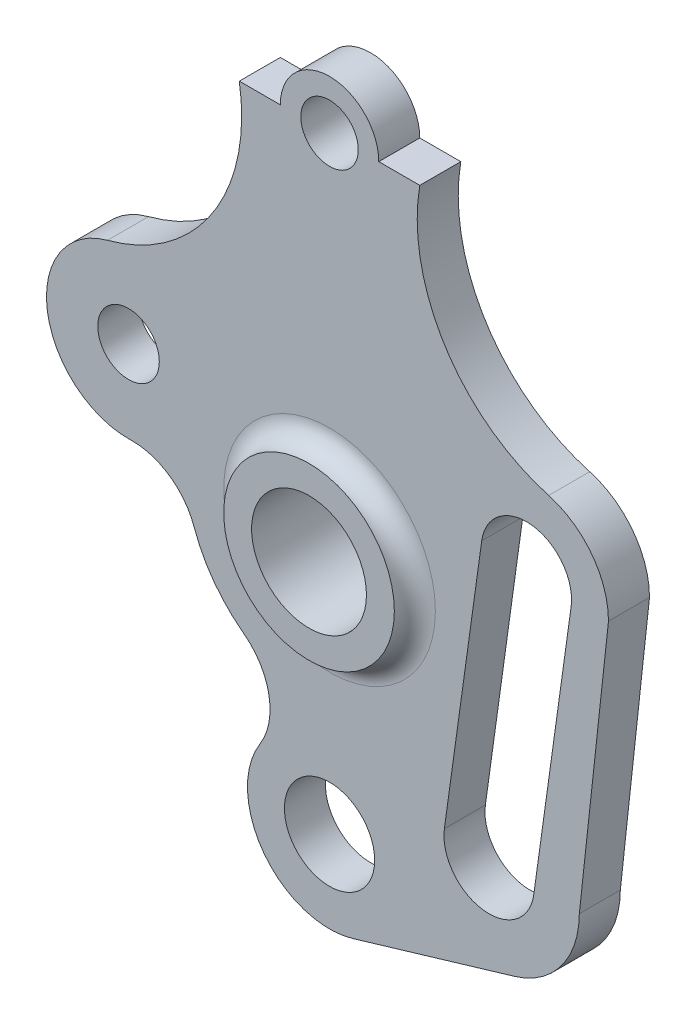
ISO-10303-21;
HEADER;
FILE_DESCRIPTION(('STEP AP214'),'2;1');
FILE_NAME('part.step','',(''),(''),'','','');
FILE_SCHEMA(('AUTOMOTIVE_DESIGN { 1 0 10303 214 1 1 1 1 }'));
ENDSEC;
DATA;
#1=APPLICATION_CONTEXT('core data for automotive mechanical design processes');
#2=APPLICATION_PROTOCOL_DEFINITION('international standard','automotive_design',2000,#1);
#3=PRODUCT_CONTEXT('',#1,'mechanical');
#4=PRODUCT('Part','Part','',(#3));
#5=PRODUCT_RELATED_PRODUCT_CATEGORY('part','',(#4));
#6=PRODUCT_DEFINITION_FORMATION('','',#4);
#7=PRODUCT_DEFINITION_CONTEXT('part definition',#1,'design');
#8=PRODUCT_DEFINITION('design','',#6,#7);
#9=PRODUCT_DEFINITION_SHAPE('','',#8);
#10=(LENGTH_UNIT() NAMED_UNIT(*) SI_UNIT(.MILLI.,.METRE.));
#11=(NAMED_UNIT(*) PLANE_ANGLE_UNIT() SI_UNIT($,.RADIAN.));
#12=(NAMED_UNIT(*) SI_UNIT($,.STERADIAN.) SOLID_ANGLE_UNIT());
#13=UNCERTAINTY_MEASURE_WITH_UNIT(LENGTH_MEASURE(1.E-05),#10,'distance_accuracy_value','');
#14=(GEOMETRIC_REPRESENTATION_CONTEXT(3) GLOBAL_UNCERTAINTY_ASSIGNED_CONTEXT((#13)) GLOBAL_UNIT_ASSIGNED_CONTEXT((#10,
#11,#12)) REPRESENTATION_CONTEXT('',''));
#15=CARTESIAN_POINT('',(0.,0.,0.));
#16=DIRECTION('',(0.,0.,1.));
#17=DIRECTION('',(1.,0.,0.));
#18=AXIS2_PLACEMENT_3D('',#15,#16,#17);
#19=CARTESIAN_POINT('',(0.,0.,10.));
#20=DIRECTION('',(0.,0.,-1.));
#21=DIRECTION('',(-1.,0.,0.));
#22=AXIS2_PLACEMENT_3D('',#19,#20,#21);
#23=CYLINDRICAL_SURFACE('',#22,20.7992005334818);
#24=CARTESIAN_POINT('',(0.,0.,-10.));
#25=DIRECTION('',(0.,0.,1.));
#26=DIRECTION('',(1.,0.,0.));
#27=AXIS2_PLACEMENT_3D('',#24,#25,#26);
#28=CIRCLE('',#27,20.7992005334818);
#29=CARTESIAN_POINT('',(20.7992005334818,0.,-10.));
#30=VERTEX_POINT('',#29);
#31=EDGE_CURVE('E339',#30,#30,#28,.T.);
#32=ORIENTED_EDGE('',*,*,#31,.T.);
#33=EDGE_LOOP('',(#32));
#34=FACE_BOUND('',#33,.T.);
#35=CARTESIAN_POINT('',(0.,0.,-5.));
#36=DIRECTION('',(0.,0.,1.));
#37=DIRECTION('',(1.,0.,0.));
#38=AXIS2_PLACEMENT_3D('',#35,#36,#37);
#39=CIRCLE('',#38,20.7992005334818);
#40=CARTESIAN_POINT('',(20.7992005334818,0.,-5.));
#41=VERTEX_POINT('',#40);
#42=EDGE_CURVE('E53',#41,#41,#39,.T.);
#43=ORIENTED_EDGE('',*,*,#42,.F.);
#44=EDGE_LOOP('',(#43));
#45=FACE_BOUND('',#44,.T.);
#46=ADVANCED_FACE('F43',(#34,#45),#23,.T.);
#47=CARTESIAN_POINT('',(0.,0.,10.));
#48=DIRECTION('',(0.,0.,-1.));
#49=DIRECTION('',(-1.,0.,0.));
#50=AXIS2_PLACEMENT_3D('',#47,#48,#49);
#51=CYLINDRICAL_SURFACE('',#50,14.);
#52=CARTESIAN_POINT('',(0.,0.,10.));
#53=DIRECTION('',(0.,0.,1.));
#54=DIRECTION('',(1.,0.,0.));
#55=AXIS2_PLACEMENT_3D('',#52,#53,#54);
#56=CIRCLE('',#55,14.);
#57=CARTESIAN_POINT('',(14.,0.,10.));
#58=VERTEX_POINT('',#57);
#59=EDGE_CURVE('E334',#58,#58,#56,.T.);
#60=ORIENTED_EDGE('',*,*,#59,.T.);
#61=EDGE_LOOP('',(#60));
#62=FACE_BOUND('',#61,.T.);
#63=CARTESIAN_POINT('',(0.,0.,-10.));
#64=DIRECTION('',(0.,0.,1.));
#65=DIRECTION('',(1.,0.,0.));
#66=AXIS2_PLACEMENT_3D('',#63,#64,#65);
#67=CIRCLE('',#66,14.);
#68=CARTESIAN_POINT('',(14.,0.,-10.));
#69=VERTEX_POINT('',#68);
#70=EDGE_CURVE('E323',#69,#69,#67,.T.);
#71=ORIENTED_EDGE('',*,*,#70,.F.);
#72=EDGE_LOOP('',(#71));
#73=FACE_BOUND('',#72,.T.);
#74=ADVANCED_FACE('F356',(#62,#73),#51,.F.);
#75=CARTESIAN_POINT('',(0.,0.,10.));
#76=DIRECTION('',(0.,0.,1.));
#77=DIRECTION('',(1.,0.,0.));
#78=AXIS2_PLACEMENT_3D('',#75,#76,#77);
#79=PLANE('',#78);
#80=ORIENTED_EDGE('',*,*,#59,.F.);
#81=EDGE_LOOP('',(#80));
#82=FACE_BOUND('',#81,.T.);
#83=CARTESIAN_POINT('',(0.,0.,10.));
#84=DIRECTION('',(0.,0.,1.));
#85=DIRECTION('',(1.,0.,0.));
#86=AXIS2_PLACEMENT_3D('',#83,#84,#85);
#87=CIRCLE('',#86,20.7992005334818);
#88=CARTESIAN_POINT('',(20.7992005334818,0.,10.));
#89=VERTEX_POINT('',#88);
#90=EDGE_CURVE('E338',#89,#89,#87,.T.);
#91=ORIENTED_EDGE('',*,*,#90,.T.);
#92=EDGE_LOOP('',(#91));
#93=FACE_BOUND('',#92,.T.);
#94=ADVANCED_FACE('F362',(#82,#93),#79,.T.);
#95=CARTESIAN_POINT('',(0.,0.,-10.));
#96=DIRECTION('',(0.,0.,1.));
#97=DIRECTION('',(1.,0.,0.));
#98=AXIS2_PLACEMENT_3D('',#95,#96,#97);
#99=PLANE('',#98);
#100=ORIENTED_EDGE('',*,*,#70,.T.);
#101=EDGE_LOOP('',(#100));
#102=FACE_BOUND('',#101,.T.);
#103=ORIENTED_EDGE('',*,*,#31,.F.);
#104=EDGE_LOOP('',(#103));
#105=FACE_BOUND('',#104,.T.);
#106=ADVANCED_FACE('F365',(#102,#105),#99,.F.);
#107=CARTESIAN_POINT('',(22.0988600567901,-74.2925929364105,5.));
#108=DIRECTION('',(-0.285111005991782,0.958494504033463,0.));
#109=DIRECTION('',(-0.958494504033463,-0.285111005991782,0.));
#110=AXIS2_PLACEMENT_3D('',#107,#108,#109);
#111=PLANE('',#110);
#112=DIRECTION('',(0.958494504033463,0.285111005991782,0.));
#113=VECTOR('',#112,1.);
#114=CARTESIAN_POINT('',(22.0988600567901,-74.2925929364105,-5.));
#115=LINE('',#114,#113);
#116=CARTESIAN_POINT('',(5.70222011983564,-79.1698900806693,-5.));
#117=VERTEX_POINT('',#116);
#118=CARTESIAN_POINT('',(45.1610925178546,-67.4325678974345,-5.));
#119=VERTEX_POINT('',#118);
#120=EDGE_CURVE('E235',#117,#119,#115,.T.);
#121=ORIENTED_EDGE('',*,*,#120,.T.);
#122=DIRECTION('',(0.,0.,-1.));
#123=VECTOR('',#122,1.);
#124=CARTESIAN_POINT('',(45.1610925178546,-67.4325678974345,5.));
#125=LINE('',#124,#123);
#126=CARTESIAN_POINT('',(45.1610925178546,-67.4325678974345,5.));
#127=VERTEX_POINT('',#126);
#128=EDGE_CURVE('E319',#127,#119,#125,.T.);
#129=ORIENTED_EDGE('',*,*,#128,.F.);
#130=DIRECTION('',(0.958494504033463,0.285111005991782,0.));
#131=VECTOR('',#130,1.);
#132=CARTESIAN_POINT('',(22.0988600567901,-74.2925929364105,5.));
#133=LINE('',#132,#131);
#134=CARTESIAN_POINT('',(5.70222011983564,-79.1698900806693,5.));
#135=VERTEX_POINT('',#134);
#136=EDGE_CURVE('E473',#135,#127,#133,.T.);
#137=ORIENTED_EDGE('',*,*,#136,.F.);
#138=DIRECTION('',(0.,0.,-1.));
#139=VECTOR('',#138,1.);
#140=CARTESIAN_POINT('',(5.70222011983564,-79.1698900806693,5.));
#141=LINE('',#140,#139);
#142=EDGE_CURVE('E283',#135,#117,#141,.T.);
#143=ORIENTED_EDGE('',*,*,#142,.T.);
#144=EDGE_LOOP('',(#121,#129,#137,#143));
#145=FACE_BOUND('',#144,.T.);
#146=ADVANCED_FACE('F368',(#145),#111,.F.);
#147=CARTESIAN_POINT('',(38.8886503860354,-46.3456888086984,5.));
#148=DIRECTION('',(0.,0.,-1.));
#149=DIRECTION('',(-1.,0.,0.));
#150=AXIS2_PLACEMENT_3D('',#147,#148,#149);
#151=CYLINDRICAL_SURFACE('',#150,22.);
#152=CARTESIAN_POINT('',(38.8886503860354,-46.3456888086984,-5.));
#153=DIRECTION('',(0.,0.,1.));
#154=DIRECTION('',(1.,0.,0.));
#155=AXIS2_PLACEMENT_3D('',#152,#153,#154);
#156=CIRCLE('',#155,22.);
#157=CARTESIAN_POINT('',(60.8886503860354,-46.3456888086984,-5.));
#158=VERTEX_POINT('',#157);
#159=EDGE_CURVE('E239',#119,#158,#156,.T.);
#160=ORIENTED_EDGE('',*,*,#159,.T.);
#161=DIRECTION('',(0.,0.,-1.));
#162=VECTOR('',#161,1.);
#163=CARTESIAN_POINT('',(60.8886503860354,-46.3456888086984,5.));
#164=LINE('',#163,#162);
#165=CARTESIAN_POINT('',(60.8886503860354,-46.3456888086984,5.));
#166=VERTEX_POINT('',#165);
#167=EDGE_CURVE('E316',#166,#158,#164,.T.);
#168=ORIENTED_EDGE('',*,*,#167,.F.);
#169=CARTESIAN_POINT('',(38.8886503860354,-46.3456888086984,5.));
#170=DIRECTION('',(0.,0.,1.));
#171=DIRECTION('',(1.,0.,0.));
#172=AXIS2_PLACEMENT_3D('',#169,#170,#171);
#173=CIRCLE('',#172,22.);
#174=EDGE_CURVE('E477',#127,#166,#173,.T.);
#175=ORIENTED_EDGE('',*,*,#174,.F.);
#176=ORIENTED_EDGE('',*,*,#128,.T.);
#177=EDGE_LOOP('',(#160,#168,#175,#176));
#178=FACE_BOUND('',#177,.T.);
#179=ADVANCED_FACE('F403',(#178),#151,.T.);
#180=CARTESIAN_POINT('',(65.1605826645187,-7.09120514030537,5.));
#181=DIRECTION('',(0.994130469274751,-0.108187846173051,0.));
#182=DIRECTION('',(0.108187846173051,0.994130469274751,0.));
#183=AXIS2_PLACEMENT_3D('',#180,#181,#182);
#184=PLANE('',#183);
#185=DIRECTION('',(-0.108187846173051,-0.994130469274751,0.));
#186=VECTOR('',#185,1.);
#187=CARTESIAN_POINT('',(65.1605826645187,-7.09120514030537,-5.));
#188=LINE('',#187,#186);
#189=CARTESIAN_POINT('',(68.,19.,-5.));
#190=VERTEX_POINT('',#189);
#191=EDGE_CURVE('E243',#190,#158,#188,.T.);
#192=ORIENTED_EDGE('',*,*,#191,.F.);
#193=DIRECTION('',(0.,0.,-1.));
#194=VECTOR('',#193,1.);
#195=CARTESIAN_POINT('',(68.,19.,5.));
#196=LINE('',#195,#194);
#197=CARTESIAN_POINT('',(68.,19.,5.));
#198=VERTEX_POINT('',#197);
#199=EDGE_CURVE('E313',#198,#190,#196,.T.);
#200=ORIENTED_EDGE('',*,*,#199,.F.);
#201=DIRECTION('',(-0.108187846173051,-0.994130469274751,0.));
#202=VECTOR('',#201,1.);
#203=CARTESIAN_POINT('',(65.1605826645187,-7.09120514030537,5.));
#204=LINE('',#203,#202);
#205=EDGE_CURVE('E484',#198,#166,#204,.T.);
#206=ORIENTED_EDGE('',*,*,#205,.T.);
#207=ORIENTED_EDGE('',*,*,#167,.T.);
#208=EDGE_LOOP('',(#192,#200,#206,#207));
#209=FACE_BOUND('',#208,.T.);
#210=ADVANCED_FACE('F407',(#209),#184,.T.);
#211=CARTESIAN_POINT('',(48.,19.,5.));
#212=DIRECTION('',(0.,0.,-1.));
#213=DIRECTION('',(-1.,0.,0.));
#214=AXIS2_PLACEMENT_3D('',#211,#212,#213);
#215=CYLINDRICAL_SURFACE('',#214,20.);
#216=CARTESIAN_POINT('',(48.,19.,-5.));
#217=DIRECTION('',(0.,0.,1.));
#218=DIRECTION('',(1.,0.,0.));
#219=AXIS2_PLACEMENT_3D('',#216,#217,#218);
#220=CIRCLE('',#219,20.);
#221=CARTESIAN_POINT('',(53.4289837072648,38.2490554549114,-5.));
#222=VERTEX_POINT('',#221);
#223=EDGE_CURVE('E247',#190,#222,#220,.T.);
#224=ORIENTED_EDGE('',*,*,#223,.T.);
#225=DIRECTION('',(0.,0.,-1.));
#226=VECTOR('',#225,1.);
#227=CARTESIAN_POINT('',(53.4289837072648,38.2490554549114,5.));
#228=LINE('',#227,#226);
#229=CARTESIAN_POINT('',(53.4289837072648,38.2490554549114,5.));
#230=VERTEX_POINT('',#229);
#231=EDGE_CURVE('E310',#230,#222,#228,.T.);
#232=ORIENTED_EDGE('',*,*,#231,.F.);
#233=CARTESIAN_POINT('',(48.,19.,5.));
#234=DIRECTION('',(0.,0.,1.));
#235=DIRECTION('',(1.,0.,0.));
#236=AXIS2_PLACEMENT_3D('',#233,#234,#235);
#237=CIRCLE('',#236,20.);
#238=EDGE_CURVE('E488',#198,#230,#237,.T.);
#239=ORIENTED_EDGE('',*,*,#238,.F.);
#240=ORIENTED_EDGE('',*,*,#199,.T.);
#241=EDGE_LOOP('',(#224,#232,#239,#240));
#242=FACE_BOUND('',#241,.T.);
#243=ADVANCED_FACE('F411',(#242),#215,.T.);
#244=CARTESIAN_POINT('',(65.3727478632474,80.5969774557164,5.));
#245=DIRECTION('',(0.,0.,-1.));
#246=DIRECTION('',(-1.,0.,0.));
#247=AXIS2_PLACEMENT_3D('',#244,#245,#246);
#248=CYLINDRICAL_SURFACE('',#247,44.);
#249=CARTESIAN_POINT('',(65.3727478632474,80.5969774557164,-5.));
#250=DIRECTION('',(0.,0.,1.));
#251=DIRECTION('',(1.,0.,0.));
#252=AXIS2_PLACEMENT_3D('',#249,#250,#251);
#253=CIRCLE('',#252,44.);
#254=CARTESIAN_POINT('',(22.,88.,-5.));
#255=VERTEX_POINT('',#254);
#256=EDGE_CURVE('E251',#255,#222,#253,.T.);
#257=ORIENTED_EDGE('',*,*,#256,.F.);
#258=DIRECTION('',(0.,0.,-1.));
#259=VECTOR('',#258,1.);
#260=CARTESIAN_POINT('',(22.,88.,5.));
#261=LINE('',#260,#259);
#262=CARTESIAN_POINT('',(22.,88.,5.));
#263=VERTEX_POINT('',#262);
#264=EDGE_CURVE('E307',#263,#255,#261,.T.);
#265=ORIENTED_EDGE('',*,*,#264,.F.);
#266=CARTESIAN_POINT('',(65.3727478632474,80.5969774557164,5.));
#267=DIRECTION('',(0.,0.,1.));
#268=DIRECTION('',(1.,0.,0.));
#269=AXIS2_PLACEMENT_3D('',#266,#267,#268);
#270=CIRCLE('',#269,44.);
#271=EDGE_CURVE('E491',#263,#230,#270,.T.);
#272=ORIENTED_EDGE('',*,*,#271,.T.);
#273=ORIENTED_EDGE('',*,*,#231,.T.);
#274=EDGE_LOOP('',(#257,#265,#272,#273));
#275=FACE_BOUND('',#274,.T.);
#276=ADVANCED_FACE('F415',(#275),#248,.F.);
#277=CARTESIAN_POINT('',(0.,88.,5.));
#278=DIRECTION('',(0.,1.,0.));
#279=DIRECTION('',(0.,0.,1.));
#280=AXIS2_PLACEMENT_3D('',#277,#278,#279);
#281=PLANE('',#280);
#282=DIRECTION('',(1.,0.,0.));
#283=VECTOR('',#282,1.);
#284=CARTESIAN_POINT('',(0.,88.,-5.));
#285=LINE('',#284,#283);
#286=CARTESIAN_POINT('',(12.,88.,-5.));
#287=VERTEX_POINT('',#286);
#288=EDGE_CURVE('E255',#287,#255,#285,.T.);
#289=ORIENTED_EDGE('',*,*,#288,.F.);
#290=DIRECTION('',(0.,0.,-1.));
#291=VECTOR('',#290,1.);
#292=CARTESIAN_POINT('',(12.,88.,5.));
#293=LINE('',#292,#291);
#294=CARTESIAN_POINT('',(12.,88.,5.));
#295=VERTEX_POINT('',#294);
#296=EDGE_CURVE('E304',#295,#287,#293,.T.);
#297=ORIENTED_EDGE('',*,*,#296,.F.);
#298=DIRECTION('',(1.,0.,0.));
#299=VECTOR('',#298,1.);
#300=CARTESIAN_POINT('',(0.,88.,5.));
#301=LINE('',#300,#299);
#302=EDGE_CURVE('E495',#295,#263,#301,.T.);
#303=ORIENTED_EDGE('',*,*,#302,.T.);
#304=ORIENTED_EDGE('',*,*,#264,.T.);
#305=EDGE_LOOP('',(#289,#297,#303,#304));
#306=FACE_BOUND('',#305,.T.);
#307=ADVANCED_FACE('F419',(#306),#281,.T.);
#308=CARTESIAN_POINT('',(0.,88.,5.));
#309=DIRECTION('',(0.,0.,-1.));
#310=DIRECTION('',(-1.,0.,0.));
#311=AXIS2_PLACEMENT_3D('',#308,#309,#310);
#312=CYLINDRICAL_SURFACE('',#311,12.);
#313=CARTESIAN_POINT('',(0.,88.,-5.));
#314=DIRECTION('',(0.,0.,1.));
#315=DIRECTION('',(1.,0.,0.));
#316=AXIS2_PLACEMENT_3D('',#313,#314,#315);
#317=CIRCLE('',#316,12.);
#318=CARTESIAN_POINT('',(-12.,88.,-5.));
#319=VERTEX_POINT('',#318);
#320=EDGE_CURVE('E259',#287,#319,#317,.T.);
#321=ORIENTED_EDGE('',*,*,#320,.T.);
#322=DIRECTION('',(0.,0.,-1.));
#323=VECTOR('',#322,1.);
#324=CARTESIAN_POINT('',(-12.,88.,5.));
#325=LINE('',#324,#323);
#326=CARTESIAN_POINT('',(-12.,88.,5.));
#327=VERTEX_POINT('',#326);
#328=EDGE_CURVE('E301',#327,#319,#325,.T.);
#329=ORIENTED_EDGE('',*,*,#328,.F.);
#330=CARTESIAN_POINT('',(0.,88.,5.));
#331=DIRECTION('',(0.,0.,1.));
#332=DIRECTION('',(1.,0.,0.));
#333=AXIS2_PLACEMENT_3D('',#330,#331,#332);
#334=CIRCLE('',#333,12.);
#335=EDGE_CURVE('E499',#295,#327,#334,.T.);
#336=ORIENTED_EDGE('',*,*,#335,.F.);
#337=ORIENTED_EDGE('',*,*,#296,.T.);
#338=EDGE_LOOP('',(#321,#329,#336,#337));
#339=FACE_BOUND('',#338,.T.);
#340=ADVANCED_FACE('F423',(#339),#312,.T.);
#341=CARTESIAN_POINT('',(0.,88.,5.));
#342=DIRECTION('',(0.,1.,0.));
#343=DIRECTION('',(0.,0.,1.));
#344=AXIS2_PLACEMENT_3D('',#341,#342,#343);
#345=PLANE('',#344);
#346=DIRECTION('',(1.,0.,0.));
#347=VECTOR('',#346,1.);
#348=CARTESIAN_POINT('',(0.,88.,-5.));
#349=LINE('',#348,#347);
#350=CARTESIAN_POINT('',(-22.,88.,-5.));
#351=VERTEX_POINT('',#350);
#352=EDGE_CURVE('E263',#351,#319,#349,.T.);
#353=ORIENTED_EDGE('',*,*,#352,.F.);
#354=DIRECTION('',(0.,0.,-1.));
#355=VECTOR('',#354,1.);
#356=CARTESIAN_POINT('',(-22.,88.,5.));
#357=LINE('',#356,#355);
#358=CARTESIAN_POINT('',(-22.,88.,5.));
#359=VERTEX_POINT('',#358);
#360=EDGE_CURVE('E298',#359,#351,#357,.T.);
#361=ORIENTED_EDGE('',*,*,#360,.F.);
#362=DIRECTION('',(1.,0.,0.));
#363=VECTOR('',#362,1.);
#364=CARTESIAN_POINT('',(0.,88.,5.));
#365=LINE('',#364,#363);
#366=EDGE_CURVE('E502',#359,#327,#365,.T.);
#367=ORIENTED_EDGE('',*,*,#366,.T.);
#368=ORIENTED_EDGE('',*,*,#328,.T.);
#369=EDGE_LOOP('',(#353,#361,#367,#368));
#370=FACE_BOUND('',#369,.T.);
#371=ADVANCED_FACE('F427',(#370),#345,.T.);
#372=CARTESIAN_POINT('',(-65.4166030040401,80.8586707407114,5.));
#373=DIRECTION('',(0.,0.,-1.));
#374=DIRECTION('',(-1.,0.,0.));
#375=AXIS2_PLACEMENT_3D('',#372,#373,#374);
#376=CYLINDRICAL_SURFACE('',#375,44.);
#377=CARTESIAN_POINT('',(-65.4166030040401,80.8586707407114,-5.));
#378=DIRECTION('',(0.,0.,1.));
#379=DIRECTION('',(1.,0.,0.));
#380=AXIS2_PLACEMENT_3D('',#377,#378,#379);
#381=CIRCLE('',#380,44.);
#382=CARTESIAN_POINT('',(-54.1301884387625,38.3308346064723,-5.));
#383=VERTEX_POINT('',#382);
#384=EDGE_CURVE('E267',#351,#383,#381,.F.);
#385=ORIENTED_EDGE('',*,*,#384,.T.);
#386=DIRECTION('',(0.,0.,-1.));
#387=VECTOR('',#386,1.);
#388=CARTESIAN_POINT('',(-54.1301884387625,38.3308346064723,5.));
#389=LINE('',#388,#387);
#390=CARTESIAN_POINT('',(-54.1301884387625,38.3308346064723,5.));
#391=VERTEX_POINT('',#390);
#392=EDGE_CURVE('E294',#391,#383,#389,.T.);
#393=ORIENTED_EDGE('',*,*,#392,.F.);
#394=CARTESIAN_POINT('',(-65.4166030040401,80.8586707407114,5.));
#395=DIRECTION('',(0.,0.,1.));
#396=DIRECTION('',(1.,0.,0.));
#397=AXIS2_PLACEMENT_3D('',#394,#395,#396);
#398=CIRCLE('',#397,44.);
#399=EDGE_CURVE('E506',#359,#391,#398,.F.);
#400=ORIENTED_EDGE('',*,*,#399,.F.);
#401=ORIENTED_EDGE('',*,*,#360,.T.);
#402=EDGE_LOOP('',(#385,#393,#400,#401));
#403=FACE_BOUND('',#402,.T.);
#404=ADVANCED_FACE('F431',(#403),#376,.F.);
#405=CARTESIAN_POINT('',(-49.,19.,5.));
#406=DIRECTION('',(0.,0.,-1.));
#407=DIRECTION('',(-1.,0.,0.));
#408=AXIS2_PLACEMENT_3D('',#405,#406,#407);
#409=CYLINDRICAL_SURFACE('',#408,20.);
#410=CARTESIAN_POINT('',(-49.,19.,-5.));
#411=DIRECTION('',(0.,0.,1.));
#412=DIRECTION('',(1.,0.,0.));
#413=AXIS2_PLACEMENT_3D('',#410,#411,#412);
#414=CIRCLE('',#413,20.);
#415=CARTESIAN_POINT('',(-48.4929723790289,-0.993572041823168,-5.));
#416=VERTEX_POINT('',#415);
#417=EDGE_CURVE('E270',#383,#416,#414,.T.);
#418=ORIENTED_EDGE('',*,*,#417,.T.);
#419=DIRECTION('',(0.,0.,-1.));
#420=VECTOR('',#419,1.);
#421=CARTESIAN_POINT('',(-48.4929723790289,-0.993572041823168,5.));
#422=LINE('',#421,#420);
#423=CARTESIAN_POINT('',(-48.4929723790289,-0.993572041823168,5.));
#424=VERTEX_POINT('',#423);
#425=EDGE_CURVE('E290',#424,#416,#422,.T.);
#426=ORIENTED_EDGE('',*,*,#425,.F.);
#427=CARTESIAN_POINT('',(-49.,19.,5.));
#428=DIRECTION('',(0.,0.,1.));
#429=DIRECTION('',(1.,0.,0.));
#430=AXIS2_PLACEMENT_3D('',#427,#428,#429);
#431=CIRCLE('',#430,20.);
#432=EDGE_CURVE('E509',#391,#424,#431,.T.);
#433=ORIENTED_EDGE('',*,*,#432,.F.);
#434=ORIENTED_EDGE('',*,*,#392,.T.);
#435=EDGE_LOOP('',(#418,#426,#433,#434));
#436=FACE_BOUND('',#435,.T.);
#437=ADVANCED_FACE('F435',(#436),#409,.T.);
#438=CARTESIAN_POINT('',(-48.0873502822521,-16.9884296752817,5.));
#439=DIRECTION('',(0.,0.,-1.));
#440=DIRECTION('',(-1.,0.,0.));
#441=AXIS2_PLACEMENT_3D('',#438,#439,#440);
#442=CYLINDRICAL_SURFACE('',#441,16.);
#443=CARTESIAN_POINT('',(-48.0873502822521,-16.9884296752817,-5.));
#444=DIRECTION('',(0.,0.,1.));
#445=DIRECTION('',(1.,0.,0.));
#446=AXIS2_PLACEMENT_3D('',#443,#444,#445);
#447=CIRCLE('',#446,16.);
#448=CARTESIAN_POINT('',(-33.001122742722,-11.6587262477423,-5.));
#449=VERTEX_POINT('',#448);
#450=EDGE_CURVE('E273',#416,#449,#447,.F.);
#451=ORIENTED_EDGE('',*,*,#450,.T.);
#452=DIRECTION('',(0.,0.,-1.));
#453=VECTOR('',#452,1.);
#454=CARTESIAN_POINT('',(-33.001122742722,-11.6587262477423,5.));
#455=LINE('',#454,#453);
#456=CARTESIAN_POINT('',(-33.001122742722,-11.6587262477423,5.));
#457=VERTEX_POINT('',#456);
#458=EDGE_CURVE('E196',#457,#449,#455,.T.);
#459=ORIENTED_EDGE('',*,*,#458,.F.);
#460=CARTESIAN_POINT('',(-48.0873502822521,-16.9884296752817,5.));
#461=DIRECTION('',(0.,0.,1.));
#462=DIRECTION('',(1.,0.,0.));
#463=AXIS2_PLACEMENT_3D('',#460,#461,#462);
#464=CIRCLE('',#463,16.);
#465=EDGE_CURVE('E185',#424,#457,#464,.F.);
#466=ORIENTED_EDGE('',*,*,#465,.F.);
#467=ORIENTED_EDGE('',*,*,#425,.T.);
#468=EDGE_LOOP('',(#451,#459,#466,#467));
#469=FACE_BOUND('',#468,.T.);
#470=ADVANCED_FACE('F439',(#469),#442,.F.);
#471=CARTESIAN_POINT('',(0.,0.,5.));
#472=DIRECTION('',(0.,0.,-1.));
#473=DIRECTION('',(-1.,0.,0.));
#474=AXIS2_PLACEMENT_3D('',#471,#472,#473);
#475=CYLINDRICAL_SURFACE('',#474,35.);
#476=CARTESIAN_POINT('',(0.,0.,-5.));
#477=DIRECTION('',(0.,0.,1.));
#478=DIRECTION('',(1.,0.,0.));
#479=AXIS2_PLACEMENT_3D('',#476,#477,#478);
#480=CIRCLE('',#479,35.);
#481=CARTESIAN_POINT('',(-20.9311967607533,-28.0514705882353,-5.));
#482=VERTEX_POINT('',#481);
#483=EDGE_CURVE('E194',#449,#482,#480,.T.);
#484=ORIENTED_EDGE('',*,*,#483,.T.);
#485=DIRECTION('',(0.,0.,-1.));
#486=VECTOR('',#485,1.);
#487=CARTESIAN_POINT('',(-20.9311967607533,-28.0514705882353,5.));
#488=LINE('',#487,#486);
#489=CARTESIAN_POINT('',(-20.9311967607533,-28.0514705882353,5.));
#490=VERTEX_POINT('',#489);
#491=EDGE_CURVE('E191',#490,#482,#488,.T.);
#492=ORIENTED_EDGE('',*,*,#491,.F.);
#493=CARTESIAN_POINT('',(0.,0.,5.));
#494=DIRECTION('',(0.,0.,1.));
#495=DIRECTION('',(1.,0.,0.));
#496=AXIS2_PLACEMENT_3D('',#493,#494,#495);
#497=CIRCLE('',#496,35.);
#498=EDGE_CURVE('E179',#457,#490,#497,.T.);
#499=ORIENTED_EDGE('',*,*,#498,.F.);
#500=ORIENTED_EDGE('',*,*,#458,.T.);
#501=EDGE_LOOP('',(#484,#492,#499,#500));
#502=FACE_BOUND('',#501,.T.);
#503=ADVANCED_FACE('F192',(#502),#475,.T.);
#504=CARTESIAN_POINT('',(-30.4997438513834,-40.875,5.));
#505=DIRECTION('',(0.,0.,-1.));
#506=DIRECTION('',(-1.,0.,0.));
#507=AXIS2_PLACEMENT_3D('',#504,#505,#506);
#508=CYLINDRICAL_SURFACE('',#507,16.);
#509=CARTESIAN_POINT('',(-30.4997438513834,-40.875,-5.));
#510=DIRECTION('',(0.,0.,1.));
#511=DIRECTION('',(1.,0.,0.));
#512=AXIS2_PLACEMENT_3D('',#509,#510,#511);
#513=CIRCLE('',#512,16.);
#514=CARTESIAN_POINT('',(-16.9443021396575,-49.375,-5.));
#515=VERTEX_POINT('',#514);
#516=EDGE_CURVE('E120',#482,#515,#513,.F.);
#517=ORIENTED_EDGE('',*,*,#516,.T.);
#518=DIRECTION('',(0.,0.,-1.));
#519=VECTOR('',#518,1.);
#520=CARTESIAN_POINT('',(-16.9443021396575,-49.375,5.));
#521=LINE('',#520,#519);
#522=CARTESIAN_POINT('',(-16.9443021396575,-49.375,5.));
#523=VERTEX_POINT('',#522);
#524=EDGE_CURVE('E197',#523,#515,#521,.T.);
#525=ORIENTED_EDGE('',*,*,#524,.F.);
#526=CARTESIAN_POINT('',(-30.4997438513834,-40.875,5.));
#527=DIRECTION('',(0.,0.,1.));
#528=DIRECTION('',(1.,0.,0.));
#529=AXIS2_PLACEMENT_3D('',#526,#527,#528);
#530=CIRCLE('',#529,16.);
#531=EDGE_CURVE('E183',#490,#523,#530,.F.);
#532=ORIENTED_EDGE('',*,*,#531,.F.);
#533=ORIENTED_EDGE('',*,*,#491,.T.);
#534=EDGE_LOOP('',(#517,#525,#532,#533));
#535=FACE_BOUND('',#534,.T.);
#536=ADVANCED_FACE('F199',(#535),#508,.F.);
#537=CARTESIAN_POINT('',(38.8886503860354,-46.3456888086984,5.));
#538=DIRECTION('',(0.,0.,-1.));
#539=DIRECTION('',(-1.,0.,0.));
#540=AXIS2_PLACEMENT_3D('',#537,#538,#539);
#541=CYLINDRICAL_SURFACE('',#540,11.);
#542=CARTESIAN_POINT('',(38.8886503860354,-46.3456888086984,-5.));
#543=DIRECTION('',(0.,0.,1.));
#544=DIRECTION('',(1.,0.,0.));
#545=AXIS2_PLACEMENT_3D('',#542,#543,#544);
#546=CIRCLE('',#545,11.);
#547=CARTESIAN_POINT('',(27.9940447634843,-44.826620564978,-5.));
#548=VERTEX_POINT('',#547);
#549=CARTESIAN_POINT('',(49.7832560085864,-47.8647570524188,-5.));
#550=VERTEX_POINT('',#549);
#551=EDGE_CURVE('E207',#548,#550,#546,.T.);
#552=ORIENTED_EDGE('',*,*,#551,.F.);
#553=DIRECTION('',(0.,0.,-1.));
#554=VECTOR('',#553,1.);
#555=CARTESIAN_POINT('',(27.9940447634843,-44.826620564978,5.));
#556=LINE('',#555,#554);
#557=CARTESIAN_POINT('',(27.9940447634843,-44.826620564978,5.));
#558=VERTEX_POINT('',#557);
#559=EDGE_CURVE('E134',#558,#548,#556,.T.);
#560=ORIENTED_EDGE('',*,*,#559,.F.);
#561=CARTESIAN_POINT('',(38.8886503860354,-46.3456888086984,5.));
#562=DIRECTION('',(0.,0.,1.));
#563=DIRECTION('',(1.,0.,0.));
#564=AXIS2_PLACEMENT_3D('',#561,#562,#563);
#565=CIRCLE('',#564,11.);
#566=CARTESIAN_POINT('',(49.7832560085864,-47.8647570524188,5.));
#567=VERTEX_POINT('',#566);
#568=EDGE_CURVE('E282',#558,#567,#565,.T.);
#569=ORIENTED_EDGE('',*,*,#568,.T.);
#570=DIRECTION('',(0.,0.,-1.));
#571=VECTOR('',#570,1.);
#572=CARTESIAN_POINT('',(49.7832560085864,-47.8647570524188,5.));
#573=LINE('',#572,#571);
#574=EDGE_CURVE('E203',#567,#550,#573,.T.);
#575=ORIENTED_EDGE('',*,*,#574,.T.);
#576=EDGE_LOOP('',(#552,#560,#569,#575));
#577=FACE_BOUND('',#576,.T.);
#578=ADVANCED_FACE('F373',(#577),#541,.F.);
#579=CARTESIAN_POINT('',(33.5912900886205,-4.68373650291656,5.));
#580=DIRECTION('',(0.990418692959184,-0.138097113065488,0.));
#581=DIRECTION('',(0.138097113065488,0.990418692959184,0.));
#582=AXIS2_PLACEMENT_3D('',#579,#580,#581);
#583=PLANE('',#582);
#584=DIRECTION('',(-0.138097113065488,-0.990418692959184,0.));
#585=VECTOR('',#584,1.);
#586=CARTESIAN_POINT('',(33.5912900886205,-4.68373650291656,-5.));
#587=LINE('',#586,#585);
#588=CARTESIAN_POINT('',(37.105394377449,20.5190682437204,-5.));
#589=VERTEX_POINT('',#588);
#590=EDGE_CURVE('E211',#589,#548,#587,.T.);
#591=ORIENTED_EDGE('',*,*,#590,.F.);
#592=DIRECTION('',(0.,0.,-1.));
#593=VECTOR('',#592,1.);
#594=CARTESIAN_POINT('',(37.105394377449,20.5190682437204,5.));
#595=LINE('',#594,#593);
#596=CARTESIAN_POINT('',(37.105394377449,20.5190682437204,5.));
#597=VERTEX_POINT('',#596);
#598=EDGE_CURVE('E329',#597,#589,#595,.T.);
#599=ORIENTED_EDGE('',*,*,#598,.F.);
#600=DIRECTION('',(-0.138097113065488,-0.990418692959184,0.));
#601=VECTOR('',#600,1.);
#602=CARTESIAN_POINT('',(33.5912900886205,-4.68373650291656,5.));
#603=LINE('',#602,#601);
#604=EDGE_CURVE('E547',#597,#558,#603,.T.);
#605=ORIENTED_EDGE('',*,*,#604,.T.);
#606=ORIENTED_EDGE('',*,*,#559,.T.);
#607=EDGE_LOOP('',(#591,#599,#605,#606));
#608=FACE_BOUND('',#607,.T.);
#609=ADVANCED_FACE('F376',(#608),#583,.T.);
#610=CARTESIAN_POINT('',(48.,19.,5.));
#611=DIRECTION('',(0.,0.,-1.));
#612=DIRECTION('',(-1.,0.,0.));
#613=AXIS2_PLACEMENT_3D('',#610,#611,#612);
#614=CYLINDRICAL_SURFACE('',#613,11.);
#615=CARTESIAN_POINT('',(48.,19.,-5.));
#616=DIRECTION('',(0.,0.,1.));
#617=DIRECTION('',(1.,0.,0.));
#618=AXIS2_PLACEMENT_3D('',#615,#616,#617);
#619=CIRCLE('',#618,11.);
#620=CARTESIAN_POINT('',(58.894605622551,17.4809317562796,-5.));
#621=VERTEX_POINT('',#620);
#622=EDGE_CURVE('E215',#621,#589,#619,.T.);
#623=ORIENTED_EDGE('',*,*,#622,.F.);
#624=DIRECTION('',(0.,0.,-1.));
#625=VECTOR('',#624,1.);
#626=CARTESIAN_POINT('',(58.894605622551,17.4809317562796,5.));
#627=LINE('',#626,#625);
#628=CARTESIAN_POINT('',(58.894605622551,17.4809317562796,5.));
#629=VERTEX_POINT('',#628);
#630=EDGE_CURVE('E326',#629,#621,#627,.T.);
#631=ORIENTED_EDGE('',*,*,#630,.F.);
#632=CARTESIAN_POINT('',(48.,19.,5.));
#633=DIRECTION('',(0.,0.,1.));
#634=DIRECTION('',(1.,0.,0.));
#635=AXIS2_PLACEMENT_3D('',#632,#633,#634);
#636=CIRCLE('',#635,11.);
#637=EDGE_CURVE('E543',#629,#597,#636,.T.);
#638=ORIENTED_EDGE('',*,*,#637,.T.);
#639=ORIENTED_EDGE('',*,*,#598,.T.);
#640=EDGE_LOOP('',(#623,#631,#638,#639));
#641=FACE_BOUND('',#640,.T.);
#642=ADVANCED_FACE('F379',(#641),#614,.F.);
#643=CARTESIAN_POINT('',(-49.,19.,5.));
#644=DIRECTION('',(0.,0.,-1.));
#645=DIRECTION('',(-1.,0.,0.));
#646=AXIS2_PLACEMENT_3D('',#643,#644,#645);
#647=CYLINDRICAL_SURFACE('',#646,7.50000000000001);
#648=CARTESIAN_POINT('',(-49.,19.,5.));
#649=DIRECTION('',(0.,0.,1.));
#650=DIRECTION('',(1.,0.,0.));
#651=AXIS2_PLACEMENT_3D('',#648,#649,#650);
#652=CIRCLE('',#651,7.50000000000001);
#653=CARTESIAN_POINT('',(-41.5,19.,5.));
#654=VERTEX_POINT('',#653);
#655=EDGE_CURVE('E471',#654,#654,#652,.T.);
#656=ORIENTED_EDGE('',*,*,#655,.T.);
#657=EDGE_LOOP('',(#656));
#658=FACE_BOUND('',#657,.T.);
#659=CARTESIAN_POINT('',(-49.,19.,-5.));
#660=DIRECTION('',(0.,0.,1.));
#661=DIRECTION('',(1.,0.,0.));
#662=AXIS2_PLACEMENT_3D('',#659,#660,#661);
#663=CIRCLE('',#662,7.50000000000001);
#664=CARTESIAN_POINT('',(-41.5,19.,-5.));
#665=VERTEX_POINT('',#664);
#666=EDGE_CURVE('E231',#665,#665,#663,.T.);
#667=ORIENTED_EDGE('',*,*,#666,.F.);
#668=EDGE_LOOP('',(#667));
#669=FACE_BOUND('',#668,.T.);
#670=ADVANCED_FACE('F383',(#658,#669),#647,.F.);
#671=CARTESIAN_POINT('',(0.,-60.,5.));
#672=DIRECTION('',(0.,0.,-1.));
#673=DIRECTION('',(-1.,0.,0.));
#674=AXIS2_PLACEMENT_3D('',#671,#672,#673);
#675=CYLINDRICAL_SURFACE('',#674,11.);
#676=CARTESIAN_POINT('',(0.,-60.,5.));
#677=DIRECTION('',(0.,0.,1.));
#678=DIRECTION('',(1.,0.,0.));
#679=AXIS2_PLACEMENT_3D('',#676,#677,#678);
#680=CIRCLE('',#679,11.);
#681=CARTESIAN_POINT('',(11.,-60.,5.));
#682=VERTEX_POINT('',#681);
#683=EDGE_CURVE('E468',#682,#682,#680,.T.);
#684=ORIENTED_EDGE('',*,*,#683,.T.);
#685=EDGE_LOOP('',(#684));
#686=FACE_BOUND('',#685,.T.);
#687=CARTESIAN_POINT('',(0.,-60.,-5.));
#688=DIRECTION('',(0.,0.,1.));
#689=DIRECTION('',(1.,0.,0.));
#690=AXIS2_PLACEMENT_3D('',#687,#688,#689);
#691=CIRCLE('',#690,11.);
#692=CARTESIAN_POINT('',(11.,-60.,-5.));
#693=VERTEX_POINT('',#692);
#694=EDGE_CURVE('E227',#693,#693,#691,.T.);
#695=ORIENTED_EDGE('',*,*,#694,.F.);
#696=EDGE_LOOP('',(#695));
#697=FACE_BOUND('',#696,.T.);
#698=ADVANCED_FACE('F393',(#686,#697),#675,.F.);
#699=CARTESIAN_POINT('',(0.,88.,5.));
#700=DIRECTION('',(0.,0.,-1.));
#701=DIRECTION('',(-1.,0.,0.));
#702=AXIS2_PLACEMENT_3D('',#699,#700,#701);
#703=CYLINDRICAL_SURFACE('',#702,7.);
#704=CARTESIAN_POINT('',(0.,88.,5.));
#705=DIRECTION('',(0.,0.,1.));
#706=DIRECTION('',(1.,0.,0.));
#707=AXIS2_PLACEMENT_3D('',#704,#705,#706);
#708=CIRCLE('',#707,7.);
#709=CARTESIAN_POINT('',(7.,88.,5.));
#710=VERTEX_POINT('',#709);
#711=EDGE_CURVE('E464',#710,#710,#708,.T.);
#712=ORIENTED_EDGE('',*,*,#711,.T.);
#713=EDGE_LOOP('',(#712));
#714=FACE_BOUND('',#713,.T.);
#715=CARTESIAN_POINT('',(0.,88.,-5.));
#716=DIRECTION('',(0.,0.,1.));
#717=DIRECTION('',(1.,0.,0.));
#718=AXIS2_PLACEMENT_3D('',#715,#716,#717);
#719=CIRCLE('',#718,7.);
#720=CARTESIAN_POINT('',(7.,88.,-5.));
#721=VERTEX_POINT('',#720);
#722=EDGE_CURVE('E223',#721,#721,#719,.T.);
#723=ORIENTED_EDGE('',*,*,#722,.F.);
#724=EDGE_LOOP('',(#723));
#725=FACE_BOUND('',#724,.T.);
#726=ADVANCED_FACE('F389',(#714,#725),#703,.F.);
#727=CARTESIAN_POINT('',(55.3805013337226,-7.72187299035729,5.));
#728=DIRECTION('',(0.990418692959184,-0.138097113065488,0.));
#729=DIRECTION('',(0.138097113065488,0.990418692959184,0.));
#730=AXIS2_PLACEMENT_3D('',#727,#728,#729);
#731=PLANE('',#730);
#732=DIRECTION('',(-0.138097113065488,-0.990418692959184,0.));
#733=VECTOR('',#732,1.);
#734=CARTESIAN_POINT('',(55.3805013337226,-7.72187299035729,-5.));
#735=LINE('',#734,#733);
#736=EDGE_CURVE('E219',#621,#550,#735,.T.);
#737=ORIENTED_EDGE('',*,*,#736,.T.);
#738=ORIENTED_EDGE('',*,*,#574,.F.);
#739=DIRECTION('',(-0.138097113065488,-0.990418692959184,0.));
#740=VECTOR('',#739,1.);
#741=CARTESIAN_POINT('',(55.3805013337226,-7.72187299035729,5.));
#742=LINE('',#741,#740);
#743=EDGE_CURVE('E540',#629,#567,#742,.T.);
#744=ORIENTED_EDGE('',*,*,#743,.F.);
#745=ORIENTED_EDGE('',*,*,#630,.T.);
#746=EDGE_LOOP('',(#737,#738,#744,#745));
#747=FACE_BOUND('',#746,.T.);
#748=ADVANCED_FACE('F385',(#747),#731,.F.);
#749=CARTESIAN_POINT('',(0.,-60.,5.));
#750=DIRECTION('',(0.,0.,-1.));
#751=DIRECTION('',(-1.,0.,0.));
#752=AXIS2_PLACEMENT_3D('',#749,#750,#751);
#753=CYLINDRICAL_SURFACE('',#752,20.);
#754=CARTESIAN_POINT('',(0.,-60.,-5.));
#755=DIRECTION('',(0.,0.,1.));
#756=DIRECTION('',(1.,0.,0.));
#757=AXIS2_PLACEMENT_3D('',#754,#755,#756);
#758=CIRCLE('',#757,20.);
#759=EDGE_CURVE('E126',#515,#117,#758,.T.);
#760=ORIENTED_EDGE('',*,*,#759,.T.);
#761=ORIENTED_EDGE('',*,*,#142,.F.);
#762=CARTESIAN_POINT('',(0.,-60.,5.));
#763=DIRECTION('',(0.,0.,1.));
#764=DIRECTION('',(1.,0.,0.));
#765=AXIS2_PLACEMENT_3D('',#762,#763,#764);
#766=CIRCLE('',#765,20.);
#767=EDGE_CURVE('E61',#523,#135,#766,.T.);
#768=ORIENTED_EDGE('',*,*,#767,.F.);
#769=ORIENTED_EDGE('',*,*,#524,.T.);
#770=EDGE_LOOP('',(#760,#761,#768,#769));
#771=FACE_BOUND('',#770,.T.);
#772=ADVANCED_FACE('F388',(#771),#753,.T.);
#773=CARTESIAN_POINT('',(0.,0.,5.));
#774=DIRECTION('',(0.,0.,1.));
#775=DIRECTION('',(1.,0.,0.));
#776=AXIS2_PLACEMENT_3D('',#773,#774,#775);
#777=PLANE('',#776);
#778=CARTESIAN_POINT('',(0.,0.,5.));
#779=DIRECTION('',(0.,0.,1.));
#780=DIRECTION('',(1.,0.,0.));
#781=AXIS2_PLACEMENT_3D('',#778,#779,#780);
#782=CIRCLE('',#781,25.7992005334818);
#783=CARTESIAN_POINT('',(25.7992005334818,0.,5.));
#784=VERTEX_POINT('',#783);
#785=EDGE_CURVE('E11',#784,#784,#782,.F.);
#786=ORIENTED_EDGE('',*,*,#785,.T.);
#787=EDGE_LOOP('',(#786));
#788=FACE_BOUND('',#787,.T.);
#789=ORIENTED_EDGE('',*,*,#568,.F.);
#790=ORIENTED_EDGE('',*,*,#604,.F.);
#791=ORIENTED_EDGE('',*,*,#637,.F.);
#792=ORIENTED_EDGE('',*,*,#743,.T.);
#793=EDGE_LOOP('',(#789,#790,#791,#792));
#794=FACE_BOUND('',#793,.T.);
#795=ORIENTED_EDGE('',*,*,#711,.F.);
#796=EDGE_LOOP('',(#795));
#797=FACE_BOUND('',#796,.T.);
#798=ORIENTED_EDGE('',*,*,#683,.F.);
#799=EDGE_LOOP('',(#798));
#800=FACE_BOUND('',#799,.T.);
#801=ORIENTED_EDGE('',*,*,#655,.F.);
#802=EDGE_LOOP('',(#801));
#803=FACE_BOUND('',#802,.T.);
#804=ORIENTED_EDGE('',*,*,#136,.T.);
#805=ORIENTED_EDGE('',*,*,#174,.T.);
#806=ORIENTED_EDGE('',*,*,#205,.F.);
#807=ORIENTED_EDGE('',*,*,#238,.T.);
#808=ORIENTED_EDGE('',*,*,#271,.F.);
#809=ORIENTED_EDGE('',*,*,#302,.F.);
#810=ORIENTED_EDGE('',*,*,#335,.T.);
#811=ORIENTED_EDGE('',*,*,#366,.F.);
#812=ORIENTED_EDGE('',*,*,#399,.T.);
#813=ORIENTED_EDGE('',*,*,#432,.T.);
#814=ORIENTED_EDGE('',*,*,#465,.T.);
#815=ORIENTED_EDGE('',*,*,#498,.T.);
#816=ORIENTED_EDGE('',*,*,#531,.T.);
#817=ORIENTED_EDGE('',*,*,#767,.T.);
#818=EDGE_LOOP('',(#804,#805,#806,#807,#808,#809,#810,#811,#812,#813,#814,#815,#816,#817));
#819=FACE_BOUND('',#818,.T.);
#820=ADVANCED_FACE('F181',(#788,#794,#797,#800,#803,#819),#777,.T.);
#821=CARTESIAN_POINT('',(0.,0.,-5.));
#822=DIRECTION('',(0.,0.,1.));
#823=DIRECTION('',(1.,0.,0.));
#824=AXIS2_PLACEMENT_3D('',#821,#822,#823);
#825=PLANE('',#824);
#826=ORIENTED_EDGE('',*,*,#42,.T.);
#827=EDGE_LOOP('',(#826));
#828=FACE_BOUND('',#827,.T.);
#829=ORIENTED_EDGE('',*,*,#551,.T.);
#830=ORIENTED_EDGE('',*,*,#736,.F.);
#831=ORIENTED_EDGE('',*,*,#622,.T.);
#832=ORIENTED_EDGE('',*,*,#590,.T.);
#833=EDGE_LOOP('',(#829,#830,#831,#832));
#834=FACE_BOUND('',#833,.T.);
#835=ORIENTED_EDGE('',*,*,#722,.T.);
#836=EDGE_LOOP('',(#835));
#837=FACE_BOUND('',#836,.T.);
#838=ORIENTED_EDGE('',*,*,#694,.T.);
#839=EDGE_LOOP('',(#838));
#840=FACE_BOUND('',#839,.T.);
#841=ORIENTED_EDGE('',*,*,#666,.T.);
#842=EDGE_LOOP('',(#841));
#843=FACE_BOUND('',#842,.T.);
#844=ORIENTED_EDGE('',*,*,#120,.F.);
#845=ORIENTED_EDGE('',*,*,#759,.F.);
#846=ORIENTED_EDGE('',*,*,#516,.F.);
#847=ORIENTED_EDGE('',*,*,#483,.F.);
#848=ORIENTED_EDGE('',*,*,#450,.F.);
#849=ORIENTED_EDGE('',*,*,#417,.F.);
#850=ORIENTED_EDGE('',*,*,#384,.F.);
#851=ORIENTED_EDGE('',*,*,#352,.T.);
#852=ORIENTED_EDGE('',*,*,#320,.F.);
#853=ORIENTED_EDGE('',*,*,#288,.T.);
#854=ORIENTED_EDGE('',*,*,#256,.T.);
#855=ORIENTED_EDGE('',*,*,#223,.F.);
#856=ORIENTED_EDGE('',*,*,#191,.T.);
#857=ORIENTED_EDGE('',*,*,#159,.F.);
#858=EDGE_LOOP('',(#844,#845,#846,#847,#848,#849,#850,#851,#852,#853,#854,#855,#856,#857));
#859=FACE_BOUND('',#858,.T.);
#860=ADVANCED_FACE('F352',(#828,#834,#837,#840,#843,#859),#825,.F.);
#861=CARTESIAN_POINT('',(0.,0.,10.));
#862=DIRECTION('',(0.,0.,1.));
#863=DIRECTION('',(1.,0.,0.));
#864=AXIS2_PLACEMENT_3D('',#861,#862,#863);
#865=TOROIDAL_SURFACE('',#864,25.7992005334818,5.);
#866=ORIENTED_EDGE('',*,*,#785,.F.);
#867=EDGE_LOOP('',(#866));
#868=FACE_BOUND('',#867,.T.);
#869=ORIENTED_EDGE('',*,*,#90,.F.);
#870=EDGE_LOOP('',(#869));
#871=FACE_BOUND('',#870,.T.);
#872=ADVANCED_FACE('F45',(#868,#871),#865,.F.);
#873=CLOSED_SHELL('',(#46,#74,#94,#106,#146,#179,#210,#243,#276,#307,#340,#371,#404,#437,#470,
#503,#536,#578,#609,#642,#670,#698,#726,#748,#772,#820,#860,#872));
#874=MANIFOLD_SOLID_BREP('B2',#873);
#875=ADVANCED_BREP_SHAPE_REPRESENTATION('',(#18,#874),#14);
#876=SHAPE_DEFINITION_REPRESENTATION(#9,#875);
ENDSEC;
END-ISO-10303-21;
